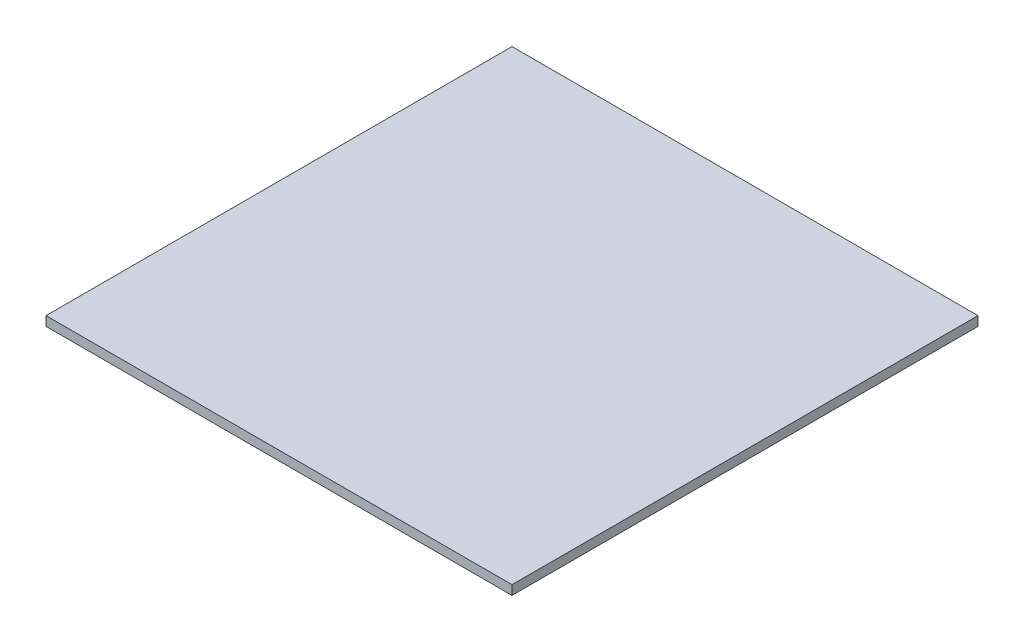
ISO-10303-21;
HEADER;
FILE_DESCRIPTION(('STEP AP214'),'2;1');
FILE_NAME('part.step','',(''),(''),'','','');
FILE_SCHEMA(('AUTOMOTIVE_DESIGN { 1 0 10303 214 1 1 1 1 }'));
ENDSEC;
DATA;
#1=APPLICATION_CONTEXT('core data for automotive mechanical design processes');
#2=APPLICATION_PROTOCOL_DEFINITION('international standard','automotive_design',2000,#1);
#3=PRODUCT_CONTEXT('',#1,'mechanical');
#4=PRODUCT('Part','Part','',(#3));
#5=PRODUCT_RELATED_PRODUCT_CATEGORY('part','',(#4));
#6=PRODUCT_DEFINITION_FORMATION('','',#4);
#7=PRODUCT_DEFINITION_CONTEXT('part definition',#1,'design');
#8=PRODUCT_DEFINITION('design','',#6,#7);
#9=PRODUCT_DEFINITION_SHAPE('','',#8);
#10=(LENGTH_UNIT() NAMED_UNIT(*) SI_UNIT(.MILLI.,.METRE.));
#11=(NAMED_UNIT(*) PLANE_ANGLE_UNIT() SI_UNIT($,.RADIAN.));
#12=(NAMED_UNIT(*) SI_UNIT($,.STERADIAN.) SOLID_ANGLE_UNIT());
#13=UNCERTAINTY_MEASURE_WITH_UNIT(LENGTH_MEASURE(1.E-05),#10,'distance_accuracy_value','');
#14=(GEOMETRIC_REPRESENTATION_CONTEXT(3) GLOBAL_UNCERTAINTY_ASSIGNED_CONTEXT((#13)) GLOBAL_UNIT_ASSIGNED_CONTEXT((#10,
#11,#12)) REPRESENTATION_CONTEXT('',''));
#15=CARTESIAN_POINT('',(0.,0.,0.));
#16=DIRECTION('',(0.,0.,1.));
#17=DIRECTION('',(1.,0.,0.));
#18=AXIS2_PLACEMENT_3D('',#15,#16,#17);
#19=CARTESIAN_POINT('',(-125.,5.,125.));
#20=DIRECTION('',(1.,0.,0.));
#21=DIRECTION('',(0.,0.,-1.));
#22=AXIS2_PLACEMENT_3D('',#19,#20,#21);
#23=PLANE('',#22);
#24=DIRECTION('',(0.,0.,1.));
#25=VECTOR('',#24,1.);
#26=CARTESIAN_POINT('',(-125.,0.,125.));
#27=LINE('',#26,#25);
#28=CARTESIAN_POINT('',(-125.,0.,-125.));
#29=VERTEX_POINT('',#28);
#30=CARTESIAN_POINT('',(-125.,0.,125.));
#31=VERTEX_POINT('',#30);
#32=EDGE_CURVE('E96',#29,#31,#27,.T.);
#33=ORIENTED_EDGE('',*,*,#32,.T.);
#34=DIRECTION('',(0.,-1.,0.));
#35=VECTOR('',#34,1.);
#36=CARTESIAN_POINT('',(-125.,5.,125.));
#37=LINE('',#36,#35);
#38=CARTESIAN_POINT('',(-125.,5.,125.));
#39=VERTEX_POINT('',#38);
#40=EDGE_CURVE('E11',#39,#31,#37,.T.);
#41=ORIENTED_EDGE('',*,*,#40,.F.);
#42=DIRECTION('',(0.,0.,1.));
#43=VECTOR('',#42,1.);
#44=CARTESIAN_POINT('',(-125.,5.,125.));
#45=LINE('',#44,#43);
#46=CARTESIAN_POINT('',(-125.,5.,-125.));
#47=VERTEX_POINT('',#46);
#48=EDGE_CURVE('E84',#47,#39,#45,.T.);
#49=ORIENTED_EDGE('',*,*,#48,.F.);
#50=DIRECTION('',(0.,-1.,0.));
#51=VECTOR('',#50,1.);
#52=CARTESIAN_POINT('',(-125.,5.,-125.));
#53=LINE('',#52,#51);
#54=EDGE_CURVE('E92',#47,#29,#53,.T.);
#55=ORIENTED_EDGE('',*,*,#54,.T.);
#56=EDGE_LOOP('',(#33,#41,#49,#55));
#57=FACE_BOUND('',#56,.T.);
#58=ADVANCED_FACE('F33',(#57),#23,.F.);
#59=CARTESIAN_POINT('',(125.,5.,125.));
#60=DIRECTION('',(0.,0.,-1.));
#61=DIRECTION('',(-1.,0.,0.));
#62=AXIS2_PLACEMENT_3D('',#59,#60,#61);
#63=PLANE('',#62);
#64=DIRECTION('',(1.,0.,0.));
#65=VECTOR('',#64,1.);
#66=CARTESIAN_POINT('',(125.,0.,125.));
#67=LINE('',#66,#65);
#68=CARTESIAN_POINT('',(125.,0.,125.));
#69=VERTEX_POINT('',#68);
#70=EDGE_CURVE('E88',#31,#69,#67,.T.);
#71=ORIENTED_EDGE('',*,*,#70,.T.);
#72=DIRECTION('',(0.,-1.,0.));
#73=VECTOR('',#72,1.);
#74=CARTESIAN_POINT('',(125.,5.,125.));
#75=LINE('',#74,#73);
#76=CARTESIAN_POINT('',(125.,5.,125.));
#77=VERTEX_POINT('',#76);
#78=EDGE_CURVE('E41',#77,#69,#75,.T.);
#79=ORIENTED_EDGE('',*,*,#78,.F.);
#80=DIRECTION('',(1.,0.,0.));
#81=VECTOR('',#80,1.);
#82=CARTESIAN_POINT('',(125.,5.,125.));
#83=LINE('',#82,#81);
#84=EDGE_CURVE('E79',#39,#77,#83,.T.);
#85=ORIENTED_EDGE('',*,*,#84,.F.);
#86=ORIENTED_EDGE('',*,*,#40,.T.);
#87=EDGE_LOOP('',(#71,#79,#85,#86));
#88=FACE_BOUND('',#87,.T.);
#89=ADVANCED_FACE('F87',(#88),#63,.F.);
#90=CARTESIAN_POINT('',(125.,5.,125.));
#91=DIRECTION('',(-1.,0.,0.));
#92=DIRECTION('',(0.,0.,1.));
#93=AXIS2_PLACEMENT_3D('',#90,#91,#92);
#94=PLANE('',#93);
#95=DIRECTION('',(0.,0.,-1.));
#96=VECTOR('',#95,1.);
#97=CARTESIAN_POINT('',(125.,0.,125.));
#98=LINE('',#97,#96);
#99=CARTESIAN_POINT('',(125.,0.,-125.));
#100=VERTEX_POINT('',#99);
#101=EDGE_CURVE('E66',#69,#100,#98,.T.);
#102=ORIENTED_EDGE('',*,*,#101,.T.);
#103=DIRECTION('',(0.,-1.,0.));
#104=VECTOR('',#103,1.);
#105=CARTESIAN_POINT('',(125.,5.,-125.));
#106=LINE('',#105,#104);
#107=CARTESIAN_POINT('',(125.,5.,-125.));
#108=VERTEX_POINT('',#107);
#109=EDGE_CURVE('E89',#108,#100,#106,.T.);
#110=ORIENTED_EDGE('',*,*,#109,.F.);
#111=DIRECTION('',(0.,0.,-1.));
#112=VECTOR('',#111,1.);
#113=CARTESIAN_POINT('',(125.,5.,125.));
#114=LINE('',#113,#112);
#115=EDGE_CURVE('E82',#77,#108,#114,.T.);
#116=ORIENTED_EDGE('',*,*,#115,.F.);
#117=ORIENTED_EDGE('',*,*,#78,.T.);
#118=EDGE_LOOP('',(#102,#110,#116,#117));
#119=FACE_BOUND('',#118,.T.);
#120=ADVANCED_FACE('F90',(#119),#94,.F.);
#121=CARTESIAN_POINT('',(125.,5.,-125.));
#122=DIRECTION('',(0.,0.,1.));
#123=DIRECTION('',(1.,0.,0.));
#124=AXIS2_PLACEMENT_3D('',#121,#122,#123);
#125=PLANE('',#124);
#126=DIRECTION('',(-1.,0.,0.));
#127=VECTOR('',#126,1.);
#128=CARTESIAN_POINT('',(125.,0.,-125.));
#129=LINE('',#128,#127);
#130=EDGE_CURVE('E72',#100,#29,#129,.T.);
#131=ORIENTED_EDGE('',*,*,#130,.T.);
#132=ORIENTED_EDGE('',*,*,#54,.F.);
#133=DIRECTION('',(-1.,0.,0.));
#134=VECTOR('',#133,1.);
#135=CARTESIAN_POINT('',(125.,5.,-125.));
#136=LINE('',#135,#134);
#137=EDGE_CURVE('E49',#108,#47,#136,.T.);
#138=ORIENTED_EDGE('',*,*,#137,.F.);
#139=ORIENTED_EDGE('',*,*,#109,.T.);
#140=EDGE_LOOP('',(#131,#132,#138,#139));
#141=FACE_BOUND('',#140,.T.);
#142=ADVANCED_FACE('F103',(#141),#125,.F.);
#143=CARTESIAN_POINT('',(0.,5.,0.));
#144=DIRECTION('',(0.,1.,0.));
#145=DIRECTION('',(0.,0.,1.));
#146=AXIS2_PLACEMENT_3D('',#143,#144,#145);
#147=PLANE('',#146);
#148=ORIENTED_EDGE('',*,*,#48,.T.);
#149=ORIENTED_EDGE('',*,*,#84,.T.);
#150=ORIENTED_EDGE('',*,*,#115,.T.);
#151=ORIENTED_EDGE('',*,*,#137,.T.);
#152=EDGE_LOOP('',(#148,#149,#150,#151));
#153=FACE_BOUND('',#152,.T.);
#154=ADVANCED_FACE('F80',(#153),#147,.T.);
#155=CARTESIAN_POINT('',(0.,0.,0.));
#156=DIRECTION('',(0.,1.,0.));
#157=DIRECTION('',(0.,0.,1.));
#158=AXIS2_PLACEMENT_3D('',#155,#156,#157);
#159=PLANE('',#158);
#160=ORIENTED_EDGE('',*,*,#32,.F.);
#161=ORIENTED_EDGE('',*,*,#130,.F.);
#162=ORIENTED_EDGE('',*,*,#101,.F.);
#163=ORIENTED_EDGE('',*,*,#70,.F.);
#164=EDGE_LOOP('',(#160,#161,#162,#163));
#165=FACE_BOUND('',#164,.T.);
#166=ADVANCED_FACE('F106',(#165),#159,.F.);
#167=CLOSED_SHELL('',(#58,#89,#120,#142,#154,#166));
#168=MANIFOLD_SOLID_BREP('B2',#167);
#169=ADVANCED_BREP_SHAPE_REPRESENTATION('',(#18,#168),#14);
#170=SHAPE_DEFINITION_REPRESENTATION(#9,#169);
ENDSEC;
END-ISO-10303-21;
